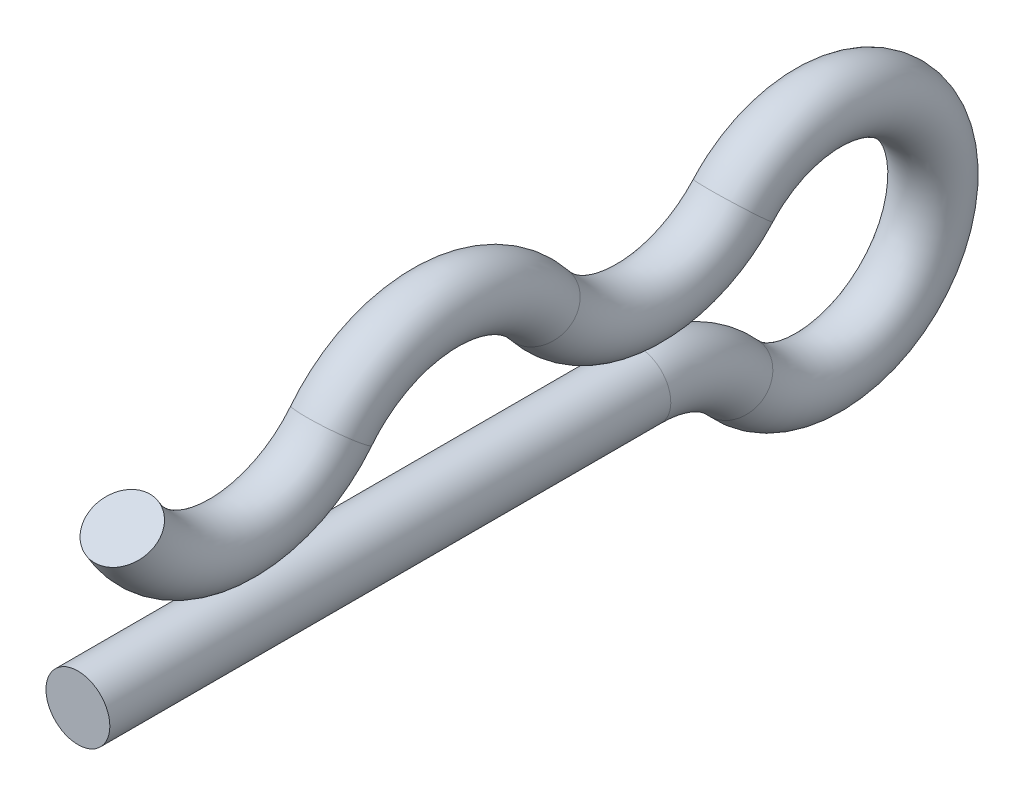
ISO-10303-21;
HEADER;
FILE_DESCRIPTION(('STEP AP214'),'2;1');
FILE_NAME('part.step','',(''),(''),'','','');
FILE_SCHEMA(('AUTOMOTIVE_DESIGN { 1 0 10303 214 1 1 1 1 }'));
ENDSEC;
DATA;
#1=APPLICATION_CONTEXT('core data for automotive mechanical design processes');
#2=APPLICATION_PROTOCOL_DEFINITION('international standard','automotive_design',2000,#1);
#3=PRODUCT_CONTEXT('',#1,'mechanical');
#4=PRODUCT('Part','Part','',(#3));
#5=PRODUCT_RELATED_PRODUCT_CATEGORY('part','',(#4));
#6=PRODUCT_DEFINITION_FORMATION('','',#4);
#7=PRODUCT_DEFINITION_CONTEXT('part definition',#1,'design');
#8=PRODUCT_DEFINITION('design','',#6,#7);
#9=PRODUCT_DEFINITION_SHAPE('','',#8);
#10=(LENGTH_UNIT() NAMED_UNIT(*) SI_UNIT(.MILLI.,.METRE.));
#11=(NAMED_UNIT(*) PLANE_ANGLE_UNIT() SI_UNIT($,.RADIAN.));
#12=(NAMED_UNIT(*) SI_UNIT($,.STERADIAN.) SOLID_ANGLE_UNIT());
#13=UNCERTAINTY_MEASURE_WITH_UNIT(LENGTH_MEASURE(1.E-05),#10,'distance_accuracy_value','');
#14=(GEOMETRIC_REPRESENTATION_CONTEXT(3) GLOBAL_UNCERTAINTY_ASSIGNED_CONTEXT((#13)) GLOBAL_UNIT_ASSIGNED_CONTEXT((#10,
#11,#12)) REPRESENTATION_CONTEXT('',''));
#15=CARTESIAN_POINT('',(0.,0.,0.));
#16=DIRECTION('',(0.,0.,1.));
#17=DIRECTION('',(1.,0.,0.));
#18=AXIS2_PLACEMENT_3D('',#15,#16,#17);
#19=CARTESIAN_POINT('',(0.,-0.7493,15.9004));
#20=DIRECTION('',(0.,0.,1.));
#21=DIRECTION('',(1.,0.,0.));
#22=AXIS2_PLACEMENT_3D('',#19,#20,#21);
#23=PLANE('',#22);
#24=CARTESIAN_POINT('',(0.,-0.7493,15.9004));
#25=DIRECTION('',(0.,0.,1.));
#26=DIRECTION('',(1.,0.,0.));
#27=AXIS2_PLACEMENT_3D('',#24,#25,#26);
#28=CIRCLE('',#27,0.6858);
#29=CARTESIAN_POINT('',(0.6858,-0.7493,15.9004));
#30=VERTEX_POINT('',#29);
#31=EDGE_CURVE('E44',#30,#30,#28,.T.);
#32=ORIENTED_EDGE('',*,*,#31,.T.);
#33=EDGE_LOOP('',(#32));
#34=FACE_BOUND('',#33,.T.);
#35=ADVANCED_FACE('F32',(#34),#23,.T.);
#36=CARTESIAN_POINT('',(0.,2.11065859316466,14.9479));
#37=DIRECTION('',(0.,-0.86602540378444,-0.499999999999997));
#38=DIRECTION('',(1.,0.,0.));
#39=AXIS2_PLACEMENT_3D('',#36,#37,#38);
#40=PLANE('',#39);
#41=CARTESIAN_POINT('',(0.,2.11065859316466,14.9479));
#42=DIRECTION('',(0.,-0.86602540378444,-0.499999999999997));
#43=DIRECTION('',(1.,0.,0.));
#44=AXIS2_PLACEMENT_3D('',#41,#42,#43);
#45=CIRCLE('',#44,0.6858);
#46=CARTESIAN_POINT('',(0.6858,2.11065859316466,14.9479));
#47=VERTEX_POINT('',#46);
#48=EDGE_CURVE('E11',#47,#47,#45,.T.);
#49=ORIENTED_EDGE('',*,*,#48,.F.);
#50=EDGE_LOOP('',(#49));
#51=FACE_BOUND('',#50,.T.);
#52=ADVANCED_FACE('F50',(#51),#40,.F.);
#53=CARTESIAN_POINT('',(0.,-0.7493,15.9004));
#54=DIRECTION('',(0.,0.,-1.));
#55=DIRECTION('',(0.,1.,0.));
#56=AXIS2_PLACEMENT_3D('',#53,#54,#55);
#57=CYLINDRICAL_SURFACE('',#56,0.6858);
#58=CARTESIAN_POINT('',(0.,-0.7493,3.85292839044839));
#59=DIRECTION('',(0.,0.,1.));
#60=DIRECTION('',(1.,0.,0.));
#61=AXIS2_PLACEMENT_3D('',#58,#59,#60);
#62=CIRCLE('',#61,0.6858);
#63=CARTESIAN_POINT('',(0.,-0.0634999999999976,3.85292839044839));
#64=VERTEX_POINT('',#63);
#65=EDGE_CURVE('E88',#64,#64,#62,.T.);
#66=ORIENTED_EDGE('',*,*,#65,.T.);
#67=EDGE_LOOP('',(#66));
#68=FACE_BOUND('',#67,.T.);
#69=ORIENTED_EDGE('',*,*,#31,.F.);
#70=EDGE_LOOP('',(#69));
#71=FACE_BOUND('',#70,.T.);
#72=ADVANCED_FACE('F52',(#68,#71),#57,.T.);
#73=CARTESIAN_POINT('',(0.,-3.4720171863293,3.85292839044839));
#74=DIRECTION('',(-1.,0.,0.));
#75=DIRECTION('',(0.,0.,1.));
#76=AXIS2_PLACEMENT_3D('',#73,#74,#75);
#77=TOROIDAL_SURFACE('',#76,2.7227171863293,0.6858);
#78=CARTESIAN_POINT('',(0.,-1.64934495276056,1.83029278171643));
#79=DIRECTION('',(0.,0.742873927151729,0.669431347008913));
#80=DIRECTION('',(1.,0.,0.));
#81=AXIS2_PLACEMENT_3D('',#78,#79,#80);
#82=CIRCLE('',#81,0.6858);
#83=CARTESIAN_POINT('',(0.,-1.19024893498184,1.32082984247577));
#84=VERTEX_POINT('',#83);
#85=EDGE_CURVE('E85',#84,#84,#82,.T.);
#86=CARTESIAN_POINT('',(0.,-3.4720171863293,3.85292839044839));
#87=DIRECTION('',(-1.,0.,0.));
#88=DIRECTION('',(0.,0.,1.));
#89=AXIS2_PLACEMENT_3D('',#86,#87,#88);
#90=CIRCLE('',#89,3.4085171863293);
#91=EDGE_CURVE('',#64,#84,#90,.T.);
#92=ORIENTED_EDGE('',*,*,#65,.F.);
#93=ORIENTED_EDGE('',*,*,#85,.T.);
#94=ORIENTED_EDGE('',*,*,#91,.T.);
#95=ORIENTED_EDGE('',*,*,#91,.F.);
#96=EDGE_LOOP('',(#92,#94,#93,#95));
#97=FACE_BOUND('',#96,.T.);
#98=ADVANCED_FACE('F57',(#97),#77,.T.);
#99=CARTESIAN_POINT('',(0.,0.,0.));
#100=DIRECTION('',(1.,0.,0.));
#101=DIRECTION('',(0.,0.,-1.));
#102=AXIS2_PLACEMENT_3D('',#99,#100,#101);
#103=TOROIDAL_SURFACE('',#102,2.4638,0.6858);
#104=CARTESIAN_POINT('',(0.,1.64934495276056,1.83029278171643));
#105=DIRECTION('',(0.,0.74287392715173,-0.669431347008912));
#106=DIRECTION('',(1.,0.,0.));
#107=AXIS2_PLACEMENT_3D('',#104,#105,#106);
#108=CIRCLE('',#107,0.6858);
#109=CARTESIAN_POINT('',(0.,1.19024893498184,1.32082984247578));
#110=VERTEX_POINT('',#109);
#111=EDGE_CURVE('E90',#110,#110,#108,.T.);
#112=ORIENTED_EDGE('',*,*,#111,.T.);
#113=EDGE_LOOP('',(#112));
#114=FACE_BOUND('',#113,.T.);
#115=ORIENTED_EDGE('',*,*,#85,.F.);
#116=EDGE_LOOP('',(#115));
#117=FACE_BOUND('',#116,.T.);
#118=ADVANCED_FACE('F73',(#114,#117),#103,.T.);
#119=CARTESIAN_POINT('',(0.,3.4720171863293,3.85292839044838));
#120=DIRECTION('',(-1.,0.,0.));
#121=DIRECTION('',(0.,0.,1.));
#122=AXIS2_PLACEMENT_3D('',#119,#120,#121);
#123=TOROIDAL_SURFACE('',#122,2.7227171863293,0.6858);
#124=CARTESIAN_POINT('',(0.,1.77793959959868,5.98442786426251));
#125=DIRECTION('',(0.,-0.782857464784199,-0.622201084723947));
#126=DIRECTION('',(1.,0.,0.));
#127=AXIS2_PLACEMENT_3D('',#124,#125,#126);
#128=CIRCLE('',#127,0.6858);
#129=CARTESIAN_POINT('',(0.,1.35123409569499,6.52131151361151));
#130=VERTEX_POINT('',#129);
#131=EDGE_CURVE('E96',#130,#130,#128,.T.);
#132=CARTESIAN_POINT('',(0.,3.4720171863293,3.85292839044838));
#133=DIRECTION('',(-1.,0.,0.));
#134=DIRECTION('',(0.,0.,1.));
#135=AXIS2_PLACEMENT_3D('',#132,#133,#134);
#136=CIRCLE('',#135,3.4085171863293);
#137=EDGE_CURVE('',#110,#130,#136,.T.);
#138=ORIENTED_EDGE('',*,*,#111,.F.);
#139=ORIENTED_EDGE('',*,*,#131,.T.);
#140=ORIENTED_EDGE('',*,*,#137,.T.);
#141=ORIENTED_EDGE('',*,*,#137,.F.);
#142=EDGE_LOOP('',(#138,#140,#139,#141));
#143=FACE_BOUND('',#142,.T.);
#144=ADVANCED_FACE('F67',(#143),#123,.T.);
#145=CARTESIAN_POINT('',(0.,0.,8.22144306988336));
#146=DIRECTION('',(1.,0.,0.));
#147=DIRECTION('',(0.,0.,-1.));
#148=AXIS2_PLACEMENT_3D('',#145,#146,#147);
#149=TOROIDAL_SURFACE('',#148,2.8575,0.6858);
#150=CARTESIAN_POINT('',(0.,1.77793959959868,10.4584582755042));
#151=DIRECTION('',(0.,0.782857464784199,-0.622201084723947));
#152=DIRECTION('',(1.,0.,0.));
#153=AXIS2_PLACEMENT_3D('',#150,#151,#152);
#154=CIRCLE('',#153,0.6858);
#155=CARTESIAN_POINT('',(0.6858,1.77793959959868,10.4584582755042));
#156=VERTEX_POINT('',#155);
#157=EDGE_CURVE('E39',#156,#156,#154,.T.);
#158=ORIENTED_EDGE('',*,*,#157,.T.);
#159=EDGE_LOOP('',(#158));
#160=FACE_BOUND('',#159,.T.);
#161=ORIENTED_EDGE('',*,*,#131,.F.);
#162=EDGE_LOOP('',(#161));
#163=FACE_BOUND('',#162,.T.);
#164=ADVANCED_FACE('F63',(#160,#163),#149,.T.);
#165=CARTESIAN_POINT('',(0.,3.4720171863293,12.5899577493183));
#166=DIRECTION('',(-1.,0.,0.));
#167=DIRECTION('',(0.,0.,1.));
#168=AXIS2_PLACEMENT_3D('',#165,#166,#167);
#169=TOROIDAL_SURFACE('',#168,2.7227171863293,0.6858);
#170=ORIENTED_EDGE('',*,*,#48,.T.);
#171=EDGE_LOOP('',(#170));
#172=FACE_BOUND('',#171,.T.);
#173=ORIENTED_EDGE('',*,*,#157,.F.);
#174=EDGE_LOOP('',(#173));
#175=FACE_BOUND('',#174,.T.);
#176=ADVANCED_FACE('F47',(#172,#175),#169,.T.);
#177=CLOSED_SHELL('',(#35,#52,#72,#98,#118,#144,#164,#176));
#178=MANIFOLD_SOLID_BREP('B2',#177);
#179=ADVANCED_BREP_SHAPE_REPRESENTATION('',(#18,#178),#14);
#180=SHAPE_DEFINITION_REPRESENTATION(#9,#179);
ENDSEC;
END-ISO-10303-21;
